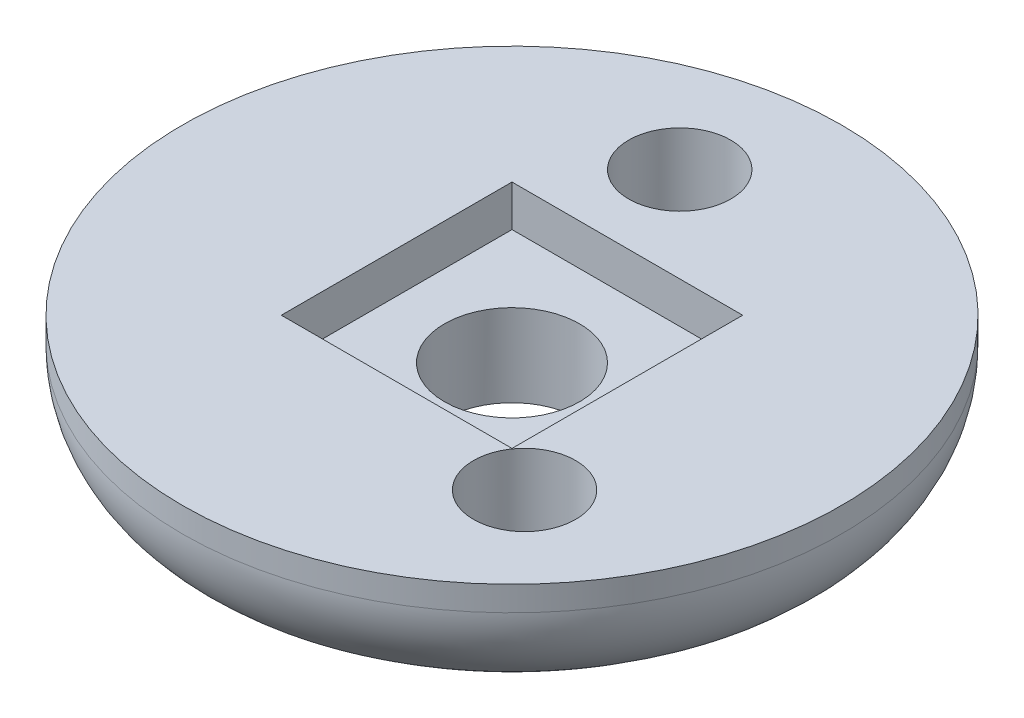
ISO-10303-21;
HEADER;
FILE_DESCRIPTION(('STEP AP214'),'2;1');
FILE_NAME('part.step','',(''),(''),'','','');
FILE_SCHEMA(('AUTOMOTIVE_DESIGN { 1 0 10303 214 1 1 1 1 }'));
ENDSEC;
DATA;
#1=APPLICATION_CONTEXT('core data for automotive mechanical design processes');
#2=APPLICATION_PROTOCOL_DEFINITION('international standard','automotive_design',2000,#1);
#3=PRODUCT_CONTEXT('',#1,'mechanical');
#4=PRODUCT('Part','Part','',(#3));
#5=PRODUCT_RELATED_PRODUCT_CATEGORY('part','',(#4));
#6=PRODUCT_DEFINITION_FORMATION('','',#4);
#7=PRODUCT_DEFINITION_CONTEXT('part definition',#1,'design');
#8=PRODUCT_DEFINITION('design','',#6,#7);
#9=PRODUCT_DEFINITION_SHAPE('','',#8);
#10=(LENGTH_UNIT() NAMED_UNIT(*) SI_UNIT(.MILLI.,.METRE.));
#11=(NAMED_UNIT(*) PLANE_ANGLE_UNIT() SI_UNIT($,.RADIAN.));
#12=(NAMED_UNIT(*) SI_UNIT($,.STERADIAN.) SOLID_ANGLE_UNIT());
#13=UNCERTAINTY_MEASURE_WITH_UNIT(LENGTH_MEASURE(1.E-05),#10,'distance_accuracy_value','');
#14=(GEOMETRIC_REPRESENTATION_CONTEXT(3) GLOBAL_UNCERTAINTY_ASSIGNED_CONTEXT((#13)) GLOBAL_UNIT_ASSIGNED_CONTEXT((#10,
#11,#12)) REPRESENTATION_CONTEXT('',''));
#15=CARTESIAN_POINT('',(0.,0.,0.));
#16=DIRECTION('',(0.,0.,1.));
#17=DIRECTION('',(1.,0.,0.));
#18=AXIS2_PLACEMENT_3D('',#15,#16,#17);
#19=CARTESIAN_POINT('',(3.5,-7.5,-3.5));
#20=DIRECTION('',(-1.,0.,0.));
#21=DIRECTION('',(0.,0.,1.));
#22=AXIS2_PLACEMENT_3D('',#19,#20,#21);
#23=PLANE('',#22);
#24=DIRECTION('',(0.,0.,1.));
#25=VECTOR('',#24,1.);
#26=CARTESIAN_POINT('',(3.5,-6.25,-3.5));
#27=LINE('',#26,#25);
#28=CARTESIAN_POINT('',(3.5,-6.25,-3.5));
#29=VERTEX_POINT('',#28);
#30=CARTESIAN_POINT('',(3.5,-6.25,3.5));
#31=VERTEX_POINT('',#30);
#32=EDGE_CURVE('E88',#29,#31,#27,.T.);
#33=ORIENTED_EDGE('',*,*,#32,.F.);
#34=DIRECTION('',(0.,1.,0.));
#35=VECTOR('',#34,1.);
#36=CARTESIAN_POINT('',(3.5,-7.5,-3.5));
#37=LINE('',#36,#35);
#38=CARTESIAN_POINT('',(3.5,-7.5,-3.5));
#39=VERTEX_POINT('',#38);
#40=EDGE_CURVE('E100',#39,#29,#37,.T.);
#41=ORIENTED_EDGE('',*,*,#40,.F.);
#42=DIRECTION('',(0.,0.,1.));
#43=VECTOR('',#42,1.);
#44=CARTESIAN_POINT('',(3.5,-7.5,-3.5));
#45=LINE('',#44,#43);
#46=CARTESIAN_POINT('',(3.5,-7.5,3.5));
#47=VERTEX_POINT('',#46);
#48=EDGE_CURVE('E199',#39,#47,#45,.T.);
#49=ORIENTED_EDGE('',*,*,#48,.T.);
#50=DIRECTION('',(0.,1.,0.));
#51=VECTOR('',#50,1.);
#52=CARTESIAN_POINT('',(3.5,-7.5,3.5));
#53=LINE('',#52,#51);
#54=EDGE_CURVE('E103',#47,#31,#53,.T.);
#55=ORIENTED_EDGE('',*,*,#54,.T.);
#56=EDGE_LOOP('',(#33,#41,#49,#55));
#57=FACE_BOUND('',#56,.T.);
#58=ADVANCED_FACE('F32',(#57),#23,.T.);
#59=CARTESIAN_POINT('',(-3.5,-7.5,3.5));
#60=DIRECTION('',(0.,0.,-1.));
#61=DIRECTION('',(-1.,0.,0.));
#62=AXIS2_PLACEMENT_3D('',#59,#60,#61);
#63=PLANE('',#62);
#64=DIRECTION('',(-1.,0.,0.));
#65=VECTOR('',#64,1.);
#66=CARTESIAN_POINT('',(-3.5,-6.25,3.5));
#67=LINE('',#66,#65);
#68=CARTESIAN_POINT('',(-3.5,-6.25,3.5));
#69=VERTEX_POINT('',#68);
#70=EDGE_CURVE('E105',#31,#69,#67,.T.);
#71=ORIENTED_EDGE('',*,*,#70,.F.);
#72=ORIENTED_EDGE('',*,*,#54,.F.);
#73=DIRECTION('',(-1.,0.,0.));
#74=VECTOR('',#73,1.);
#75=CARTESIAN_POINT('',(-3.5,-7.5,3.5));
#76=LINE('',#75,#74);
#77=CARTESIAN_POINT('',(-3.5,-7.5,3.5));
#78=VERTEX_POINT('',#77);
#79=EDGE_CURVE('E201',#47,#78,#76,.T.);
#80=ORIENTED_EDGE('',*,*,#79,.T.);
#81=DIRECTION('',(0.,1.,0.));
#82=VECTOR('',#81,1.);
#83=CARTESIAN_POINT('',(-3.5,-7.5,3.5));
#84=LINE('',#83,#82);
#85=EDGE_CURVE('E112',#78,#69,#84,.T.);
#86=ORIENTED_EDGE('',*,*,#85,.T.);
#87=EDGE_LOOP('',(#71,#72,#80,#86));
#88=FACE_BOUND('',#87,.T.);
#89=ADVANCED_FACE('F157',(#88),#63,.T.);
#90=CARTESIAN_POINT('',(-3.5,-7.5,-3.5));
#91=DIRECTION('',(1.,0.,0.));
#92=DIRECTION('',(0.,0.,-1.));
#93=AXIS2_PLACEMENT_3D('',#90,#91,#92);
#94=PLANE('',#93);
#95=DIRECTION('',(0.,0.,-1.));
#96=VECTOR('',#95,1.);
#97=CARTESIAN_POINT('',(-3.5,-6.25,-3.5));
#98=LINE('',#97,#96);
#99=CARTESIAN_POINT('',(-3.5,-6.25,-3.5));
#100=VERTEX_POINT('',#99);
#101=EDGE_CURVE('E49',#69,#100,#98,.T.);
#102=ORIENTED_EDGE('',*,*,#101,.F.);
#103=ORIENTED_EDGE('',*,*,#85,.F.);
#104=DIRECTION('',(0.,0.,-1.));
#105=VECTOR('',#104,1.);
#106=CARTESIAN_POINT('',(-3.5,-7.5,-3.5));
#107=LINE('',#106,#105);
#108=CARTESIAN_POINT('',(-3.5,-7.5,-3.5));
#109=VERTEX_POINT('',#108);
#110=EDGE_CURVE('E114',#78,#109,#107,.T.);
#111=ORIENTED_EDGE('',*,*,#110,.T.);
#112=DIRECTION('',(0.,1.,0.));
#113=VECTOR('',#112,1.);
#114=CARTESIAN_POINT('',(-3.5,-7.5,-3.5));
#115=LINE('',#114,#113);
#116=EDGE_CURVE('E110',#109,#100,#115,.T.);
#117=ORIENTED_EDGE('',*,*,#116,.T.);
#118=EDGE_LOOP('',(#102,#103,#111,#117));
#119=FACE_BOUND('',#118,.T.);
#120=ADVANCED_FACE('F154',(#119),#94,.T.);
#121=CARTESIAN_POINT('',(-3.5,-7.5,-3.5));
#122=DIRECTION('',(0.,0.,1.));
#123=DIRECTION('',(1.,0.,0.));
#124=AXIS2_PLACEMENT_3D('',#121,#122,#123);
#125=PLANE('',#124);
#126=DIRECTION('',(1.,0.,0.));
#127=VECTOR('',#126,1.);
#128=CARTESIAN_POINT('',(-3.5,-6.25,-3.5));
#129=LINE('',#128,#127);
#130=EDGE_CURVE('E84',#100,#29,#129,.T.);
#131=ORIENTED_EDGE('',*,*,#130,.F.);
#132=ORIENTED_EDGE('',*,*,#116,.F.);
#133=DIRECTION('',(1.,0.,0.));
#134=VECTOR('',#133,1.);
#135=CARTESIAN_POINT('',(-3.5,-7.5,-3.5));
#136=LINE('',#135,#134);
#137=EDGE_CURVE('E109',#109,#39,#136,.T.);
#138=ORIENTED_EDGE('',*,*,#137,.T.);
#139=ORIENTED_EDGE('',*,*,#40,.T.);
#140=EDGE_LOOP('',(#131,#132,#138,#139));
#141=FACE_BOUND('',#140,.T.);
#142=ADVANCED_FACE('F107',(#141),#125,.T.);
#143=CARTESIAN_POINT('',(0.,-7.5,0.));
#144=DIRECTION('',(0.,1.,0.));
#145=DIRECTION('',(0.,0.,1.));
#146=AXIS2_PLACEMENT_3D('',#143,#144,#145);
#147=PLANE('',#146);
#148=CARTESIAN_POINT('',(0.,-7.5,0.));
#149=DIRECTION('',(0.,1.,0.));
#150=DIRECTION('',(0.,0.,1.));
#151=AXIS2_PLACEMENT_3D('',#148,#149,#150);
#152=CIRCLE('',#151,2.05);
#153=CARTESIAN_POINT('',(0.,-7.5,2.05));
#154=VERTEX_POINT('',#153);
#155=EDGE_CURVE('E194',#154,#154,#152,.F.);
#156=ORIENTED_EDGE('',*,*,#155,.T.);
#157=EDGE_LOOP('',(#156));
#158=FACE_BOUND('',#157,.T.);
#159=ORIENTED_EDGE('',*,*,#48,.F.);
#160=ORIENTED_EDGE('',*,*,#137,.F.);
#161=ORIENTED_EDGE('',*,*,#110,.F.);
#162=ORIENTED_EDGE('',*,*,#79,.F.);
#163=EDGE_LOOP('',(#159,#160,#161,#162));
#164=FACE_BOUND('',#163,.T.);
#165=ADVANCED_FACE('F147',(#158,#164),#147,.T.);
#166=CARTESIAN_POINT('',(0.,-10.,0.));
#167=DIRECTION('',(0.,1.,0.));
#168=DIRECTION('',(0.,0.,1.));
#169=AXIS2_PLACEMENT_3D('',#166,#167,#168);
#170=CYLINDRICAL_SURFACE('',#169,2.05);
#171=ORIENTED_EDGE('',*,*,#155,.F.);
#172=EDGE_LOOP('',(#171));
#173=FACE_BOUND('',#172,.T.);
#174=CARTESIAN_POINT('',(0.,-10.,0.));
#175=DIRECTION('',(0.,-1.,0.));
#176=DIRECTION('',(0.,0.,-1.));
#177=AXIS2_PLACEMENT_3D('',#174,#175,#176);
#178=CIRCLE('',#177,2.05);
#179=CARTESIAN_POINT('',(0.,-10.,-2.05));
#180=VERTEX_POINT('',#179);
#181=EDGE_CURVE('E191',#180,#180,#178,.T.);
#182=ORIENTED_EDGE('',*,*,#181,.T.);
#183=EDGE_LOOP('',(#182));
#184=FACE_BOUND('',#183,.T.);
#185=ADVANCED_FACE('F143',(#173,#184),#170,.F.);
#186=CARTESIAN_POINT('',(0.,-10.,0.));
#187=DIRECTION('',(0.,1.,0.));
#188=DIRECTION('',(0.,0.,1.));
#189=AXIS2_PLACEMENT_3D('',#186,#187,#188);
#190=CYLINDRICAL_SURFACE('',#189,10.);
#191=CARTESIAN_POINT('',(0.,-6.25,0.));
#192=DIRECTION('',(0.,-1.,0.));
#193=DIRECTION('',(0.,0.,-1.));
#194=AXIS2_PLACEMENT_3D('',#191,#192,#193);
#195=CIRCLE('',#194,10.);
#196=CARTESIAN_POINT('',(0.,-6.25,-10.));
#197=VERTEX_POINT('',#196);
#198=EDGE_CURVE('E175',#197,#197,#195,.T.);
#199=ORIENTED_EDGE('',*,*,#198,.T.);
#200=EDGE_LOOP('',(#199));
#201=FACE_BOUND('',#200,.T.);
#202=CARTESIAN_POINT('',(0.,-7.,0.));
#203=DIRECTION('',(0.,1.,0.));
#204=DIRECTION('',(0.,0.,1.));
#205=AXIS2_PLACEMENT_3D('',#202,#203,#204);
#206=CIRCLE('',#205,10.);
#207=CARTESIAN_POINT('',(0.,-7.,10.));
#208=VERTEX_POINT('',#207);
#209=EDGE_CURVE('E178',#208,#208,#206,.T.);
#210=ORIENTED_EDGE('',*,*,#209,.T.);
#211=EDGE_LOOP('',(#210));
#212=FACE_BOUND('',#211,.T.);
#213=ADVANCED_FACE('F146',(#201,#212),#190,.T.);
#214=CARTESIAN_POINT('',(0.,-10.,0.));
#215=DIRECTION('',(0.,1.,0.));
#216=DIRECTION('',(0.,0.,1.));
#217=AXIS2_PLACEMENT_3D('',#214,#215,#216);
#218=PLANE('',#217);
#219=CARTESIAN_POINT('',(4.78310190252404,-10.,4.40135617623374));
#220=DIRECTION('',(0.,1.,0.));
#221=DIRECTION('',(0.,0.,1.));
#222=AXIS2_PLACEMENT_3D('',#219,#220,#221);
#223=CIRCLE('',#222,1.55);
#224=CARTESIAN_POINT('',(6.05402523005159,-10.,3.51408288375486));
#225=VERTEX_POINT('',#224);
#226=CARTESIAN_POINT('',(4.00435693052841,-10.,5.74152641489431));
#227=VERTEX_POINT('',#226);
#228=EDGE_CURVE('E187',#225,#227,#223,.T.);
#229=ORIENTED_EDGE('',*,*,#228,.T.);
#230=CARTESIAN_POINT('',(0.,-10.,0.));
#231=DIRECTION('',(0.,1.,0.));
#232=DIRECTION('',(0.,0.,1.));
#233=AXIS2_PLACEMENT_3D('',#230,#231,#232);
#234=CIRCLE('',#233,7.);
#235=CARTESIAN_POINT('',(-2.83228320108191,-10.,-6.40141951983068));
#236=VERTEX_POINT('',#235);
#237=EDGE_CURVE('E11',#227,#236,#234,.F.);
#238=ORIENTED_EDGE('',*,*,#237,.T.);
#239=CARTESIAN_POINT('',(-1.2825584744925,-10.,-6.37220870338594));
#240=DIRECTION('',(0.,1.,0.));
#241=DIRECTION('',(0.,0.,1.));
#242=AXIS2_PLACEMENT_3D('',#239,#240,#241);
#243=CIRCLE('',#242,1.55);
#244=CARTESIAN_POINT('',(0.135191743981975,-10.,-6.99869439198192));
#245=VERTEX_POINT('',#244);
#246=EDGE_CURVE('E104',#236,#245,#243,.T.);
#247=ORIENTED_EDGE('',*,*,#246,.T.);
#248=CARTESIAN_POINT('',(0.,-10.,0.));
#249=DIRECTION('',(0.,1.,0.));
#250=DIRECTION('',(0.,0.,1.));
#251=AXIS2_PLACEMENT_3D('',#248,#249,#250);
#252=CIRCLE('',#251,7.);
#253=EDGE_CURVE('E42',#245,#225,#252,.F.);
#254=ORIENTED_EDGE('',*,*,#253,.T.);
#255=EDGE_LOOP('',(#229,#238,#247,#254));
#256=FACE_BOUND('',#255,.T.);
#257=ORIENTED_EDGE('',*,*,#181,.F.);
#258=EDGE_LOOP('',(#257));
#259=FACE_BOUND('',#258,.T.);
#260=ADVANCED_FACE('F139',(#256,#259),#218,.F.);
#261=CARTESIAN_POINT('',(4.78310190252404,3.,4.40135617623374));
#262=DIRECTION('',(0.,1.,0.));
#263=DIRECTION('',(0.,0.,1.));
#264=AXIS2_PLACEMENT_3D('',#261,#262,#263);
#265=CYLINDRICAL_SURFACE('',#264,1.54999999999999);
#266=CARTESIAN_POINT('',(4.78310190252404,-6.25,4.40135617623374));
#267=DIRECTION('',(0.,-1.,0.));
#268=DIRECTION('',(0.,0.,-1.));
#269=AXIS2_PLACEMENT_3D('',#266,#267,#268);
#270=CIRCLE('',#269,1.54999999999999);
#271=CARTESIAN_POINT('',(4.78310190252404,-6.25,2.85135617623375));
#272=VERTEX_POINT('',#271);
#273=EDGE_CURVE('E94',#272,#272,#270,.F.);
#274=ORIENTED_EDGE('',*,*,#273,.T.);
#275=EDGE_LOOP('',(#274));
#276=FACE_BOUND('',#275,.T.);
#277=ORIENTED_EDGE('',*,*,#228,.F.);
#278=CARTESIAN_POINT('',(6.05402523005159,-10.,3.51408288375486));
#279=CARTESIAN_POINT('',(6.07837642638126,-10.0000015986772,3.5489607841167));
#280=CARTESIAN_POINT('',(6.10127356391482,-9.99925586918454,3.58482172818159));
#281=CARTESIAN_POINT('',(6.14401843904844,-9.99644624741517,3.65824757929055));
#282=CARTESIAN_POINT('',(6.16386753221462,-9.99438294322588,3.69581171918319));
#283=CARTESIAN_POINT('',(6.21852809060005,-9.98649933179938,3.81043399755292));
#284=CARTESIAN_POINT('',(6.24863275092402,-9.97898273194864,3.88968070090783));
#285=CARTESIAN_POINT('',(6.29546102814028,-9.96100993768185,4.05153801842009));
#286=CARTESIAN_POINT('',(6.31220065058441,-9.95055727974766,4.13414448399894));
#287=CARTESIAN_POINT('',(6.33211695686919,-9.92829918293887,4.30085137599471));
#288=CARTESIAN_POINT('',(6.33528460353574,-9.91649284806073,4.38495276042623));
#289=CARTESIAN_POINT('',(6.3278414081899,-9.89261865121791,4.55590350621977));
#290=CARTESIAN_POINT('',(6.31668287936564,-9.88055880785939,4.6427306107177));
#291=CARTESIAN_POINT('',(6.27985312457533,-9.85826575631343,4.81350049794943));
#292=CARTESIAN_POINT('',(6.25418289298358,-9.84803242303263,4.89744347789185));
#293=CARTESIAN_POINT('',(6.18892904374746,-9.8307698807995,5.05999811461538));
#294=CARTESIAN_POINT('',(6.14936129680113,-9.82373703789096,5.13861573121159));
#295=CARTESIAN_POINT('',(6.05735235788914,-9.81383193464933,5.28819875384572));
#296=CARTESIAN_POINT('',(6.00491522147776,-9.8109583655606,5.359166560462));
#297=CARTESIAN_POINT('',(5.89103134931307,-9.80979613002268,5.48861553966101));
#298=CARTESIAN_POINT('',(5.83001753369712,-9.81133242794717,5.5474766963368));
#299=CARTESIAN_POINT('',(5.69936596657021,-9.81841120703508,5.65438664852109));
#300=CARTESIAN_POINT('',(5.62972805058683,-9.82395376461264,5.70243523777113));
#301=CARTESIAN_POINT('',(5.48429511601585,-9.83828735297629,5.7862137206498));
#302=CARTESIAN_POINT('',(5.40854021091439,-9.84705837890741,5.82201691003685));
#303=CARTESIAN_POINT('',(5.25251725809413,-9.86677292525053,5.88091878816926));
#304=CARTESIAN_POINT('',(5.17224869654001,-9.87771669336817,5.90401602722697));
#305=CARTESIAN_POINT('',(5.00613467814121,-9.90087798065979,5.93765103378535));
#306=CARTESIAN_POINT('',(4.92019279869364,-9.91312769015551,5.94769113801805));
#307=CARTESIAN_POINT('',(4.74766597509056,-9.9369135310257,5.95335403529544));
#308=CARTESIAN_POINT('',(4.66108059897172,-9.94844912316121,5.94896606561365));
#309=CARTESIAN_POINT('',(4.48796718607773,-9.96926146129884,5.92555089970068));
#310=CARTESIAN_POINT('',(4.40146978769766,-9.97849251691644,5.90625462929418));
#311=CARTESIAN_POINT('',(4.2328651751814,-9.99254503555234,5.8530809112733));
#312=CARTESIAN_POINT('',(4.15074604270135,-9.99737911274101,5.81924558751751));
#313=CARTESIAN_POINT('',(4.04924347380053,-9.99972863081401,5.76686972337325));
#314=CARTESIAN_POINT('',(4.0266321410922,-10.0000027425883,5.75447650332643));
#315=CARTESIAN_POINT('',(4.00435693052842,-10.,5.7415264148943));
#316=B_SPLINE_CURVE_WITH_KNOTS('',3,(#278,#279,#280,#281,#282,#283,#284,#285,#286,#287,#288,
#289,#290,#291,#292,#293,#294,#295,#296,#297,#298,#299,#300,#301,#302,#303,#304,#305,#306,#307,
#308,#309,#310,#311,#312,#313,#314,#315),.UNSPECIFIED.,.F.,.F.,(4,2,2,2,2,2,2,2,2,2,2,2,2,2,2,2,
2,2,4),(0.,0.127521475599893,0.254986072901818,0.508982677066442,0.762674644656369,
1.01653551193783,1.28039663397967,1.54423967785924,1.80778239242936,2.07124216270049,
2.32439104383069,2.57754475357145,2.82915552884664,3.08079500574703,3.34176881928819,
3.60293735229253,3.86893299789443,4.13416311885836,4.21148354195658),.UNSPECIFIED.);
#317=EDGE_CURVE('E121',#225,#227,#316,.T.);
#318=ORIENTED_EDGE('',*,*,#317,.T.);
#319=EDGE_LOOP('',(#277,#318));
#320=FACE_BOUND('',#319,.T.);
#321=ADVANCED_FACE('F134',(#276,#320),#265,.F.);
#322=CARTESIAN_POINT('',(-1.2825584744925,3.,-6.37220870338594));
#323=DIRECTION('',(0.,1.,0.));
#324=DIRECTION('',(0.,0.,1.));
#325=AXIS2_PLACEMENT_3D('',#322,#323,#324);
#326=CYLINDRICAL_SURFACE('',#325,1.54999999999999);
#327=CARTESIAN_POINT('',(-1.2825584744925,-6.25,-6.37220870338594));
#328=DIRECTION('',(0.,-1.,0.));
#329=DIRECTION('',(0.,0.,-1.));
#330=AXIS2_PLACEMENT_3D('',#327,#328,#329);
#331=CIRCLE('',#330,1.54999999999999);
#332=CARTESIAN_POINT('',(-1.2825584744925,-6.25,-7.92220870338593));
#333=VERTEX_POINT('',#332);
#334=EDGE_CURVE('E37',#333,#333,#331,.F.);
#335=ORIENTED_EDGE('',*,*,#334,.T.);
#336=EDGE_LOOP('',(#335));
#337=FACE_BOUND('',#336,.T.);
#338=ORIENTED_EDGE('',*,*,#246,.F.);
#339=CARTESIAN_POINT('',(-2.83228320108191,-10.,-6.40141951983068));
#340=CARTESIAN_POINT('',(-2.83148301728236,-10.0000015986772,-6.44394960802978));
#341=CARTESIAN_POINT('',(-2.82892865661492,-9.99925586918454,-6.48642032097455));
#342=CARTESIAN_POINT('',(-2.82035135460159,-9.99644624741517,-6.57094788956277));
#343=CARTESIAN_POINT('',(-2.81432996085201,-9.99438294322588,-6.61300492134944));
#344=CARTESIAN_POINT('',(-2.79117799669797,-9.98649933179938,-6.73786496258556));
#345=CARTESIAN_POINT('',(-2.76895313498513,-9.97898273194864,-6.81967196771157));
#346=CARTESIAN_POINT('',(-2.71170066286105,-9.96100993768185,-6.97814225898092));
#347=CARTESIAN_POINT('',(-2.67668843968652,-9.95055727974766,-7.05481159668107));
#348=CARTESIAN_POINT('',(-2.59481321736546,-9.92829918293887,-7.20138681649941));
#349=CARTESIAN_POINT('',(-2.54794234388465,-9.91649284806073,-7.27128816175003));
#350=CARTESIAN_POINT('',(-2.44143834511157,-9.89261865121791,-7.40521521984386));
#351=CARTESIAN_POINT('',(-2.38137521413737,-9.88055880785939,-7.46890100427488));
#352=CARTESIAN_POINT('',(-2.2512032953629,-9.85826575631343,-7.58540875846155));
#353=CARTESIAN_POINT('',(-2.18109519611199,-9.84803242303263,-7.63823147224088));
#354=CARTESIAN_POINT('',(-2.03275650497373,-9.8307698807995,-7.73138568562835));
#355=CARTESIAN_POINT('',(-1.9545352496594,-9.82373703789096,-7.77173133539045));
#356=CARTESIAN_POINT('',(-1.79217575974751,-9.81383193464933,-7.83866504539989));
#357=CARTESIAN_POINT('',(-1.70803939513775,-9.8109583655606,-7.86525743155091));
#358=CARTESIAN_POINT('',(-1.5398172062738,-9.80979613002268,-7.90304459509504));
#359=CARTESIAN_POINT('',(-1.45585827272193,-9.81133242794717,-7.91480125014917));
#360=CARTESIAN_POINT('',(-1.28731884135732,-9.81841120703508,-7.92449815398798));
#361=CARTESIAN_POINT('',(-1.20273833171929,-9.82395376461264,-7.92243813923158));
#362=CARTESIAN_POINT('',(-1.03583685941402,-9.83828735297629,-7.90473302150494));
#363=CARTESIAN_POINT('',(-0.953505267072938,-9.8470583789074,-7.88917079416443));
#364=CARTESIAN_POINT('',(-0.792658391430227,-9.86677292525053,-7.84511542388728));
#365=CARTESIAN_POINT('',(-0.714143544532119,-9.87771669336817,-7.81662080610387));
#366=CARTESIAN_POINT('',(-0.559984319827799,-9.90087798065979,-7.74619272780166));
#367=CARTESIAN_POINT('',(-0.484554453626734,-9.91312769015551,-7.70379997345763));
#368=CARTESIAN_POINT('',(-0.341648753841418,-9.9369135310257,-7.60697263105368));
#369=CARTESIAN_POINT('',(-0.274178896963387,-9.94844912316121,-7.55252908186345));
#370=CARTESIAN_POINT('',(-0.147890293181529,-9.96926146129884,-7.43183230364066));
#371=CARTESIAN_POINT('',(-0.089254491092017,-9.97849251691644,-7.36537939782427));
#372=CARTESIAN_POINT('',(0.0158947785014115,-9.99254503555234,-7.22325765158573));
#373=CARTESIAN_POINT('',(0.0624426479308963,-9.99737911274101,-7.14761588465429));
#374=CARTESIAN_POINT('',(0.113774190624312,-9.99972863081401,-7.04558120739681));
#375=CARTESIAN_POINT('',(0.124782591078882,-10.0000027425883,-7.02226427386327));
#376=CARTESIAN_POINT('',(0.13519174398197,-10.,-6.99869439198191));
#377=B_SPLINE_CURVE_WITH_KNOTS('',3,(#339,#340,#341,#342,#343,#344,#345,#346,#347,#348,#349,
#350,#351,#352,#353,#354,#355,#356,#357,#358,#359,#360,#361,#362,#363,#364,#365,#366,#367,#368,
#369,#370,#371,#372,#373,#374,#375,#376),.UNSPECIFIED.,.F.,.F.,(4,2,2,2,2,2,2,2,2,2,2,2,2,2,2,2,
2,2,4),(0.,0.127521475599895,0.254986072901819,0.508982677066441,0.762674644656368,
1.01653551193783,1.28039663397967,1.54423967785924,1.80778239242935,2.07124216270048,
2.32439104383069,2.57754475357145,2.82915552884664,3.08079500574703,3.34176881928819,
3.60293735229253,3.86893299789443,4.13416311885836,4.21148354195658),.UNSPECIFIED.);
#378=EDGE_CURVE('E57',#236,#245,#377,.T.);
#379=ORIENTED_EDGE('',*,*,#378,.T.);
#380=EDGE_LOOP('',(#338,#379));
#381=FACE_BOUND('',#380,.T.);
#382=ADVANCED_FACE('F138',(#337,#381),#326,.F.);
#383=CARTESIAN_POINT('',(0.,-7.,0.));
#384=DIRECTION('',(0.,1.,0.));
#385=DIRECTION('',(0.,0.,1.));
#386=AXIS2_PLACEMENT_3D('',#383,#384,#385);
#387=TOROIDAL_SURFACE('',#386,7.,3.);
#388=ORIENTED_EDGE('',*,*,#378,.F.);
#389=ORIENTED_EDGE('',*,*,#237,.F.);
#390=ORIENTED_EDGE('',*,*,#317,.F.);
#391=ORIENTED_EDGE('',*,*,#253,.F.);
#392=EDGE_LOOP('',(#388,#389,#390,#391));
#393=FACE_BOUND('',#392,.T.);
#394=ORIENTED_EDGE('',*,*,#209,.F.);
#395=EDGE_LOOP('',(#394));
#396=FACE_BOUND('',#395,.T.);
#397=ADVANCED_FACE('F34',(#393,#396),#387,.T.);
#398=CARTESIAN_POINT('',(0.,-6.25,0.));
#399=DIRECTION('',(0.,-1.,0.));
#400=DIRECTION('',(0.,0.,-1.));
#401=AXIS2_PLACEMENT_3D('',#398,#399,#400);
#402=PLANE('',#401);
#403=ORIENTED_EDGE('',*,*,#32,.T.);
#404=ORIENTED_EDGE('',*,*,#70,.T.);
#405=ORIENTED_EDGE('',*,*,#101,.T.);
#406=ORIENTED_EDGE('',*,*,#130,.T.);
#407=EDGE_LOOP('',(#403,#404,#405,#406));
#408=FACE_BOUND('',#407,.T.);
#409=ORIENTED_EDGE('',*,*,#334,.F.);
#410=EDGE_LOOP('',(#409));
#411=FACE_BOUND('',#410,.T.);
#412=ORIENTED_EDGE('',*,*,#198,.F.);
#413=EDGE_LOOP('',(#412));
#414=FACE_BOUND('',#413,.T.);
#415=ORIENTED_EDGE('',*,*,#273,.F.);
#416=EDGE_LOOP('',(#415));
#417=FACE_BOUND('',#416,.T.);
#418=ADVANCED_FACE('F86',(#408,#411,#414,#417),#402,.F.);
#419=CLOSED_SHELL('',(#58,#89,#120,#142,#165,#185,#213,#260,#321,#382,#397,#418));
#420=MANIFOLD_SOLID_BREP('B2',#419);
#421=ADVANCED_BREP_SHAPE_REPRESENTATION('',(#18,#420),#14);
#422=SHAPE_DEFINITION_REPRESENTATION(#9,#421);
ENDSEC;
END-ISO-10303-21;
